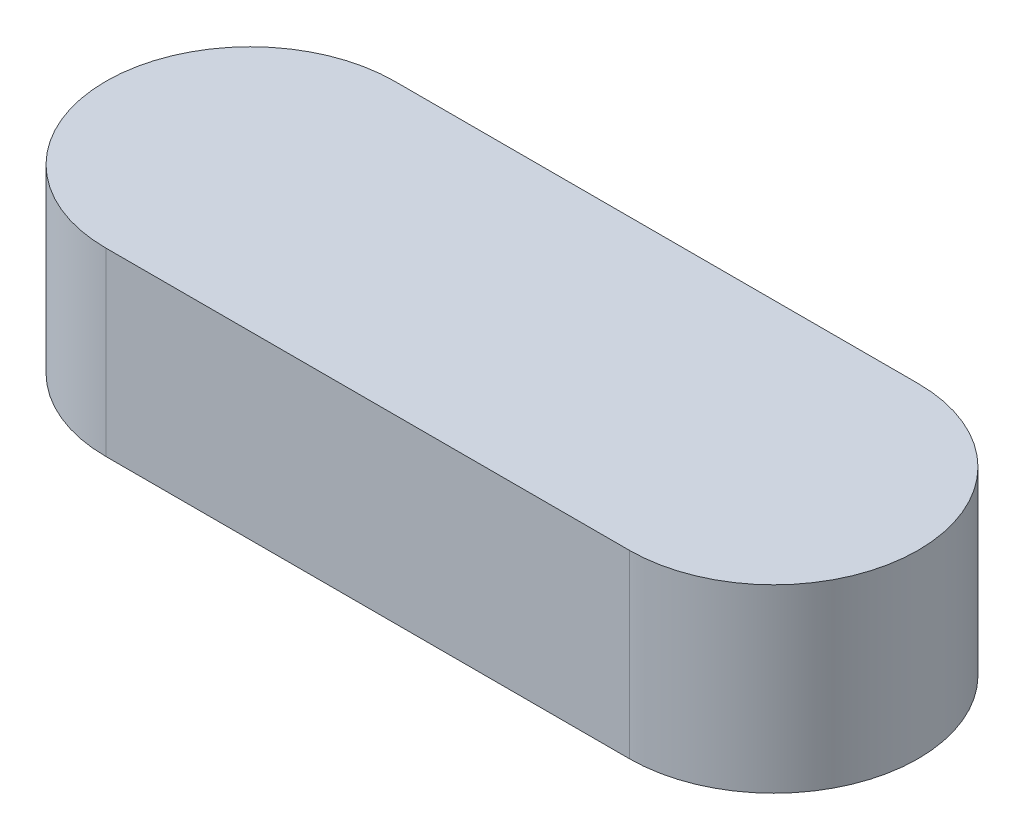
ISO-10303-21;
HEADER;
FILE_DESCRIPTION(('STEP AP214'),'2;1');
FILE_NAME('part.step','',(''),(''),'','','');
FILE_SCHEMA(('AUTOMOTIVE_DESIGN { 1 0 10303 214 1 1 1 1 }'));
ENDSEC;
DATA;
#1=APPLICATION_CONTEXT('core data for automotive mechanical design processes');
#2=APPLICATION_PROTOCOL_DEFINITION('international standard','automotive_design',2000,#1);
#3=PRODUCT_CONTEXT('',#1,'mechanical');
#4=PRODUCT('Part','Part','',(#3));
#5=PRODUCT_RELATED_PRODUCT_CATEGORY('part','',(#4));
#6=PRODUCT_DEFINITION_FORMATION('','',#4);
#7=PRODUCT_DEFINITION_CONTEXT('part definition',#1,'design');
#8=PRODUCT_DEFINITION('design','',#6,#7);
#9=PRODUCT_DEFINITION_SHAPE('','',#8);
#10=(LENGTH_UNIT() NAMED_UNIT(*) SI_UNIT(.MILLI.,.METRE.));
#11=(NAMED_UNIT(*) PLANE_ANGLE_UNIT() SI_UNIT($,.RADIAN.));
#12=(NAMED_UNIT(*) SI_UNIT($,.STERADIAN.) SOLID_ANGLE_UNIT());
#13=UNCERTAINTY_MEASURE_WITH_UNIT(LENGTH_MEASURE(1.E-05),#10,'distance_accuracy_value','');
#14=(GEOMETRIC_REPRESENTATION_CONTEXT(3) GLOBAL_UNCERTAINTY_ASSIGNED_CONTEXT((#13)) GLOBAL_UNIT_ASSIGNED_CONTEXT((#10,
#11,#12)) REPRESENTATION_CONTEXT('',''));
#15=CARTESIAN_POINT('',(0.,0.,0.));
#16=DIRECTION('',(0.,0.,1.));
#17=DIRECTION('',(1.,0.,0.));
#18=AXIS2_PLACEMENT_3D('',#15,#16,#17);
#19=CARTESIAN_POINT('',(0.,0.,0.));
#20=DIRECTION('',(0.,1.,0.));
#21=DIRECTION('',(1.,0.,0.));
#22=AXIS2_PLACEMENT_3D('',#19,#20,#21);
#23=PLANE('',#22);
#24=CARTESIAN_POINT('',(0.,0.,0.));
#25=DIRECTION('',(0.,1.,0.));
#26=DIRECTION('',(0.,0.,-1.));
#27=AXIS2_PLACEMENT_3D('',#24,#25,#26);
#28=CIRCLE('',#27,8.);
#29=CARTESIAN_POINT('',(0.,0.,-8.));
#30=VERTEX_POINT('',#29);
#31=CARTESIAN_POINT('',(0.,0.,8.));
#32=VERTEX_POINT('',#31);
#33=EDGE_CURVE('E92',#30,#32,#28,.T.);
#34=ORIENTED_EDGE('',*,*,#33,.T.);
#35=DIRECTION('',(1.,0.,0.));
#36=VECTOR('',#35,1.);
#37=CARTESIAN_POINT('',(0.,0.,8.));
#38=LINE('',#37,#36);
#39=CARTESIAN_POINT('',(29.,0.,8.));
#40=VERTEX_POINT('',#39);
#41=EDGE_CURVE('E20',#32,#40,#38,.T.);
#42=ORIENTED_EDGE('',*,*,#41,.T.);
#43=CARTESIAN_POINT('',(29.,0.,0.));
#44=DIRECTION('',(0.,1.,0.));
#45=DIRECTION('',(0.,0.,1.));
#46=AXIS2_PLACEMENT_3D('',#43,#44,#45);
#47=CIRCLE('',#46,8.);
#48=CARTESIAN_POINT('',(29.,0.,-8.));
#49=VERTEX_POINT('',#48);
#50=EDGE_CURVE('E101',#40,#49,#47,.T.);
#51=ORIENTED_EDGE('',*,*,#50,.T.);
#52=DIRECTION('',(-1.,0.,0.));
#53=VECTOR('',#52,1.);
#54=CARTESIAN_POINT('',(29.,0.,-8.));
#55=LINE('',#54,#53);
#56=EDGE_CURVE('E82',#49,#30,#55,.T.);
#57=ORIENTED_EDGE('',*,*,#56,.T.);
#58=EDGE_LOOP('',(#34,#42,#51,#57));
#59=FACE_BOUND('',#58,.T.);
#60=ADVANCED_FACE('F17',(#59),#23,.T.);
#61=CARTESIAN_POINT('',(0.,-10.,0.));
#62=DIRECTION('',(0.,1.,0.));
#63=DIRECTION('',(1.,0.,0.));
#64=AXIS2_PLACEMENT_3D('',#61,#62,#63);
#65=PLANE('',#64);
#66=CARTESIAN_POINT('',(0.,-10.,0.));
#67=DIRECTION('',(0.,1.,0.));
#68=DIRECTION('',(0.,0.,-1.));
#69=AXIS2_PLACEMENT_3D('',#66,#67,#68);
#70=CIRCLE('',#69,8.);
#71=CARTESIAN_POINT('',(0.,-10.,-8.));
#72=VERTEX_POINT('',#71);
#73=CARTESIAN_POINT('',(0.,-10.,8.));
#74=VERTEX_POINT('',#73);
#75=EDGE_CURVE('E72',#72,#74,#70,.T.);
#76=ORIENTED_EDGE('',*,*,#75,.F.);
#77=DIRECTION('',(-1.,0.,0.));
#78=VECTOR('',#77,1.);
#79=CARTESIAN_POINT('',(29.,-10.,-8.));
#80=LINE('',#79,#78);
#81=CARTESIAN_POINT('',(29.,-10.,-8.));
#82=VERTEX_POINT('',#81);
#83=EDGE_CURVE('E100',#82,#72,#80,.T.);
#84=ORIENTED_EDGE('',*,*,#83,.F.);
#85=CARTESIAN_POINT('',(29.,-10.,0.));
#86=DIRECTION('',(0.,1.,0.));
#87=DIRECTION('',(0.,0.,1.));
#88=AXIS2_PLACEMENT_3D('',#85,#86,#87);
#89=CIRCLE('',#88,8.);
#90=CARTESIAN_POINT('',(29.,-10.,8.));
#91=VERTEX_POINT('',#90);
#92=EDGE_CURVE('E74',#91,#82,#89,.T.);
#93=ORIENTED_EDGE('',*,*,#92,.F.);
#94=DIRECTION('',(1.,0.,0.));
#95=VECTOR('',#94,1.);
#96=CARTESIAN_POINT('',(0.,-10.,8.));
#97=LINE('',#96,#95);
#98=EDGE_CURVE('E11',#74,#91,#97,.T.);
#99=ORIENTED_EDGE('',*,*,#98,.F.);
#100=EDGE_LOOP('',(#76,#84,#93,#99));
#101=FACE_BOUND('',#100,.T.);
#102=ADVANCED_FACE('F69',(#101),#65,.F.);
#103=CARTESIAN_POINT('',(0.,-10.,8.));
#104=DIRECTION('',(0.,0.,1.));
#105=DIRECTION('',(1.,0.,0.));
#106=AXIS2_PLACEMENT_3D('',#103,#104,#105);
#107=PLANE('',#106);
#108=ORIENTED_EDGE('',*,*,#41,.F.);
#109=DIRECTION('',(0.,1.,0.));
#110=VECTOR('',#109,1.);
#111=CARTESIAN_POINT('',(0.,-10.,8.));
#112=LINE('',#111,#110);
#113=EDGE_CURVE('E77',#74,#32,#112,.T.);
#114=ORIENTED_EDGE('',*,*,#113,.F.);
#115=ORIENTED_EDGE('',*,*,#98,.T.);
#116=DIRECTION('',(0.,1.,0.));
#117=VECTOR('',#116,1.);
#118=CARTESIAN_POINT('',(29.,-10.,8.));
#119=LINE('',#118,#117);
#120=EDGE_CURVE('E103',#91,#40,#119,.T.);
#121=ORIENTED_EDGE('',*,*,#120,.T.);
#122=EDGE_LOOP('',(#108,#114,#115,#121));
#123=FACE_BOUND('',#122,.T.);
#124=ADVANCED_FACE('F78',(#123),#107,.T.);
#125=CARTESIAN_POINT('',(29.,-5.,0.));
#126=DIRECTION('',(0.,1.,0.));
#127=DIRECTION('',(0.,0.,1.));
#128=AXIS2_PLACEMENT_3D('',#125,#126,#127);
#129=CYLINDRICAL_SURFACE('',#128,8.);
#130=ORIENTED_EDGE('',*,*,#50,.F.);
#131=ORIENTED_EDGE('',*,*,#120,.F.);
#132=ORIENTED_EDGE('',*,*,#92,.T.);
#133=DIRECTION('',(0.,1.,0.));
#134=VECTOR('',#133,1.);
#135=CARTESIAN_POINT('',(29.,-10.,-8.));
#136=LINE('',#135,#134);
#137=EDGE_CURVE('E96',#82,#49,#136,.T.);
#138=ORIENTED_EDGE('',*,*,#137,.T.);
#139=EDGE_LOOP('',(#130,#131,#132,#138));
#140=FACE_BOUND('',#139,.T.);
#141=ADVANCED_FACE('F121',(#140),#129,.T.);
#142=CARTESIAN_POINT('',(0.,-10.,-8.));
#143=DIRECTION('',(0.,0.,-1.));
#144=DIRECTION('',(0.,-1.,0.));
#145=AXIS2_PLACEMENT_3D('',#142,#143,#144);
#146=PLANE('',#145);
#147=ORIENTED_EDGE('',*,*,#56,.F.);
#148=ORIENTED_EDGE('',*,*,#137,.F.);
#149=ORIENTED_EDGE('',*,*,#83,.T.);
#150=DIRECTION('',(0.,1.,0.));
#151=VECTOR('',#150,1.);
#152=CARTESIAN_POINT('',(0.,-10.,-8.));
#153=LINE('',#152,#151);
#154=EDGE_CURVE('E86',#72,#30,#153,.T.);
#155=ORIENTED_EDGE('',*,*,#154,.T.);
#156=EDGE_LOOP('',(#147,#148,#149,#155));
#157=FACE_BOUND('',#156,.T.);
#158=ADVANCED_FACE('F120',(#157),#146,.T.);
#159=CARTESIAN_POINT('',(0.,-5.,0.));
#160=DIRECTION('',(0.,1.,0.));
#161=DIRECTION('',(0.,0.,1.));
#162=AXIS2_PLACEMENT_3D('',#159,#160,#161);
#163=CYLINDRICAL_SURFACE('',#162,8.);
#164=ORIENTED_EDGE('',*,*,#33,.F.);
#165=ORIENTED_EDGE('',*,*,#154,.F.);
#166=ORIENTED_EDGE('',*,*,#75,.T.);
#167=ORIENTED_EDGE('',*,*,#113,.T.);
#168=EDGE_LOOP('',(#164,#165,#166,#167));
#169=FACE_BOUND('',#168,.T.);
#170=ADVANCED_FACE('F84',(#169),#163,.T.);
#171=CLOSED_SHELL('',(#60,#102,#124,#141,#158,#170));
#172=MANIFOLD_SOLID_BREP('B1',#171);
#173=ADVANCED_BREP_SHAPE_REPRESENTATION('',(#18,#172),#14);
#174=SHAPE_DEFINITION_REPRESENTATION(#9,#173);
ENDSEC;
END-ISO-10303-21;
